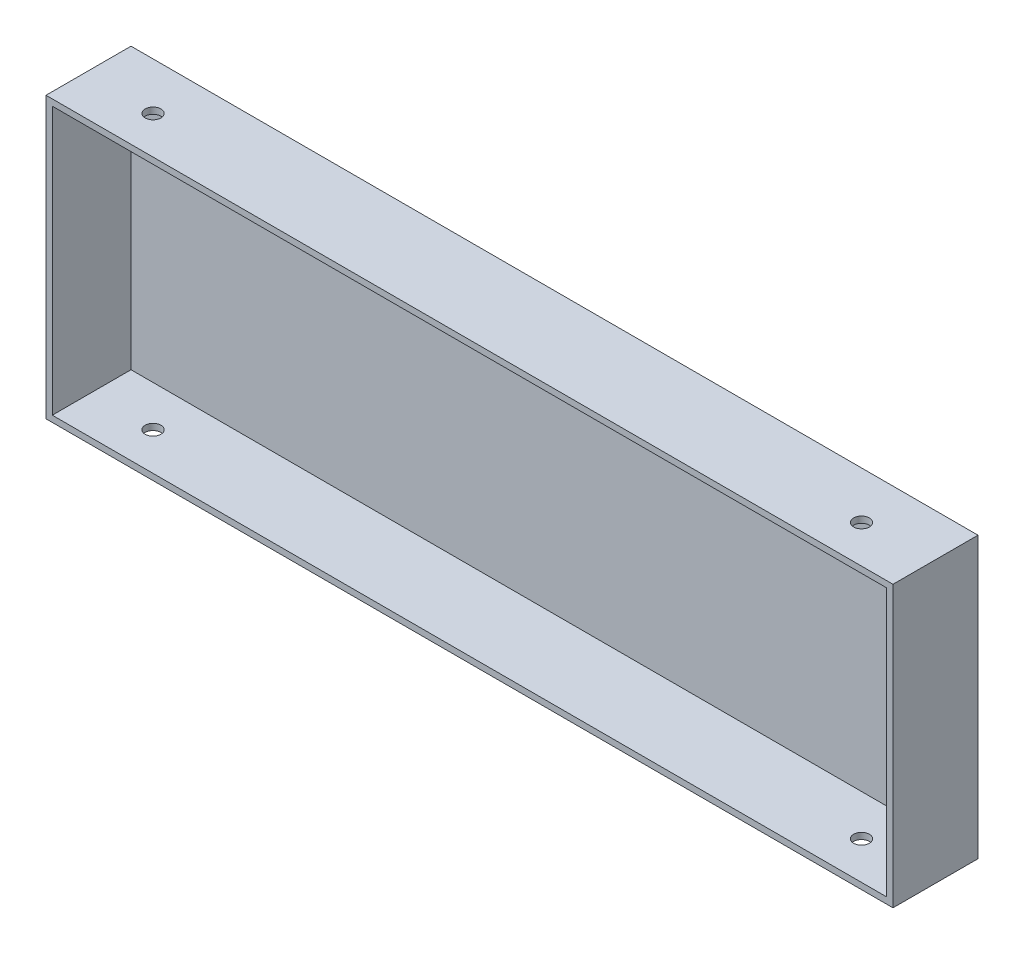
ISO-10303-21;
HEADER;
FILE_DESCRIPTION(('STEP AP214'),'2;1');
FILE_NAME('part.step','',(''),(''),'','','');
FILE_SCHEMA(('AUTOMOTIVE_DESIGN { 1 0 10303 214 1 1 1 1 }'));
ENDSEC;
DATA;
#1=APPLICATION_CONTEXT('core data for automotive mechanical design processes');
#2=APPLICATION_PROTOCOL_DEFINITION('international standard','automotive_design',2000,#1);
#3=PRODUCT_CONTEXT('',#1,'mechanical');
#4=PRODUCT('Part','Part','',(#3));
#5=PRODUCT_RELATED_PRODUCT_CATEGORY('part','',(#4));
#6=PRODUCT_DEFINITION_FORMATION('','',#4);
#7=PRODUCT_DEFINITION_CONTEXT('part definition',#1,'design');
#8=PRODUCT_DEFINITION('design','',#6,#7);
#9=PRODUCT_DEFINITION_SHAPE('','',#8);
#10=(LENGTH_UNIT() NAMED_UNIT(*) SI_UNIT(.MILLI.,.METRE.));
#11=(NAMED_UNIT(*) PLANE_ANGLE_UNIT() SI_UNIT($,.RADIAN.));
#12=(NAMED_UNIT(*) SI_UNIT($,.STERADIAN.) SOLID_ANGLE_UNIT());
#13=UNCERTAINTY_MEASURE_WITH_UNIT(LENGTH_MEASURE(1.E-05),#10,'distance_accuracy_value','');
#14=(GEOMETRIC_REPRESENTATION_CONTEXT(3) GLOBAL_UNCERTAINTY_ASSIGNED_CONTEXT((#13)) GLOBAL_UNIT_ASSIGNED_CONTEXT((#10,
#11,#12)) REPRESENTATION_CONTEXT('',''));
#15=CARTESIAN_POINT('',(0.,0.,0.));
#16=DIRECTION('',(0.,0.,1.));
#17=DIRECTION('',(1.,0.,0.));
#18=AXIS2_PLACEMENT_3D('',#15,#16,#17);
#19=CARTESIAN_POINT('',(0.,0.,-2.));
#20=DIRECTION('',(0.,0.,-1.));
#21=DIRECTION('',(-1.,0.,0.));
#22=AXIS2_PLACEMENT_3D('',#19,#20,#21);
#23=PLANE('',#22);
#24=DIRECTION('',(0.,1.,0.));
#25=VECTOR('',#24,1.);
#26=CARTESIAN_POINT('',(-2.,0.,-2.));
#27=LINE('',#26,#25);
#28=CARTESIAN_POINT('',(-2.,-2.,-2.));
#29=VERTEX_POINT('',#28);
#30=CARTESIAN_POINT('',(-2.,87.,-2.));
#31=VERTEX_POINT('',#30);
#32=EDGE_CURVE('E184',#29,#31,#27,.T.);
#33=ORIENTED_EDGE('',*,*,#32,.T.);
#34=DIRECTION('',(1.,0.,0.));
#35=VECTOR('',#34,1.);
#36=CARTESIAN_POINT('',(0.,87.,-2.));
#37=LINE('',#36,#35);
#38=CARTESIAN_POINT('',(267.,87.,-2.));
#39=VERTEX_POINT('',#38);
#40=EDGE_CURVE('E192',#31,#39,#37,.T.);
#41=ORIENTED_EDGE('',*,*,#40,.T.);
#42=DIRECTION('',(0.,1.,0.));
#43=VECTOR('',#42,1.);
#44=CARTESIAN_POINT('',(267.,0.,-2.));
#45=LINE('',#44,#43);
#46=CARTESIAN_POINT('',(267.,-2.,-2.));
#47=VERTEX_POINT('',#46);
#48=EDGE_CURVE('E201',#47,#39,#45,.T.);
#49=ORIENTED_EDGE('',*,*,#48,.F.);
#50=DIRECTION('',(1.,0.,0.));
#51=VECTOR('',#50,1.);
#52=CARTESIAN_POINT('',(0.,-2.,-2.));
#53=LINE('',#52,#51);
#54=EDGE_CURVE('E198',#29,#47,#53,.T.);
#55=ORIENTED_EDGE('',*,*,#54,.F.);
#56=EDGE_LOOP('',(#33,#41,#49,#55));
#57=FACE_BOUND('',#56,.T.);
#58=DIRECTION('',(0.,-1.,0.));
#59=VECTOR('',#58,1.);
#60=CARTESIAN_POINT('',(157.5,43.5,-2.));
#61=LINE('',#60,#59);
#62=CARTESIAN_POINT('',(157.5,43.5,-2.));
#63=VERTEX_POINT('',#62);
#64=CARTESIAN_POINT('',(157.5,41.5,-2.));
#65=VERTEX_POINT('',#64);
#66=EDGE_CURVE('E57',#63,#65,#61,.T.);
#67=ORIENTED_EDGE('',*,*,#66,.F.);
#68=DIRECTION('',(1.,0.,0.));
#69=VECTOR('',#68,1.);
#70=CARTESIAN_POINT('',(107.5,43.5,-2.));
#71=LINE('',#70,#69);
#72=CARTESIAN_POINT('',(107.5,43.5,-2.));
#73=VERTEX_POINT('',#72);
#74=EDGE_CURVE('E52',#73,#63,#71,.T.);
#75=ORIENTED_EDGE('',*,*,#74,.F.);
#76=DIRECTION('',(0.,-1.,0.));
#77=VECTOR('',#76,1.);
#78=CARTESIAN_POINT('',(107.5,43.5,-2.));
#79=LINE('',#78,#77);
#80=CARTESIAN_POINT('',(107.5,41.5,-2.));
#81=VERTEX_POINT('',#80);
#82=EDGE_CURVE('E157',#73,#81,#79,.T.);
#83=ORIENTED_EDGE('',*,*,#82,.T.);
#84=DIRECTION('',(1.,0.,0.));
#85=VECTOR('',#84,1.);
#86=CARTESIAN_POINT('',(107.5,41.5,-2.));
#87=LINE('',#86,#85);
#88=EDGE_CURVE('E149',#81,#65,#87,.T.);
#89=ORIENTED_EDGE('',*,*,#88,.T.);
#90=EDGE_LOOP('',(#67,#75,#83,#89));
#91=FACE_BOUND('',#90,.T.);
#92=ADVANCED_FACE('F36',(#57,#91),#23,.T.);
#93=CARTESIAN_POINT('',(-2.,0.,25.));
#94=DIRECTION('',(-1.,0.,0.));
#95=DIRECTION('',(0.,0.,1.));
#96=AXIS2_PLACEMENT_3D('',#93,#94,#95);
#97=PLANE('',#96);
#98=ORIENTED_EDGE('',*,*,#32,.F.);
#99=DIRECTION('',(0.,0.,-1.));
#100=VECTOR('',#99,1.);
#101=CARTESIAN_POINT('',(-2.,-2.,25.));
#102=LINE('',#101,#100);
#103=CARTESIAN_POINT('',(-2.,-2.,25.));
#104=VERTEX_POINT('',#103);
#105=EDGE_CURVE('E11',#104,#29,#102,.T.);
#106=ORIENTED_EDGE('',*,*,#105,.F.);
#107=DIRECTION('',(0.,1.,0.));
#108=VECTOR('',#107,1.);
#109=CARTESIAN_POINT('',(-2.,0.,25.));
#110=LINE('',#109,#108);
#111=CARTESIAN_POINT('',(-2.,87.,25.));
#112=VERTEX_POINT('',#111);
#113=EDGE_CURVE('E200',#104,#112,#110,.T.);
#114=ORIENTED_EDGE('',*,*,#113,.T.);
#115=DIRECTION('',(0.,0.,-1.));
#116=VECTOR('',#115,1.);
#117=CARTESIAN_POINT('',(-2.,87.,25.));
#118=LINE('',#117,#116);
#119=EDGE_CURVE('E194',#112,#31,#118,.T.);
#120=ORIENTED_EDGE('',*,*,#119,.T.);
#121=EDGE_LOOP('',(#98,#106,#114,#120));
#122=FACE_BOUND('',#121,.T.);
#123=ADVANCED_FACE('F224',(#122),#97,.T.);
#124=CARTESIAN_POINT('',(0.,-2.,25.));
#125=DIRECTION('',(0.,1.,0.));
#126=DIRECTION('',(0.,0.,1.));
#127=AXIS2_PLACEMENT_3D('',#124,#125,#126);
#128=PLANE('',#127);
#129=CARTESIAN_POINT('',(245.,-2.,13.));
#130=DIRECTION('',(0.,1.,0.));
#131=DIRECTION('',(0.,0.,1.));
#132=AXIS2_PLACEMENT_3D('',#129,#130,#131);
#133=CIRCLE('',#132,2.5);
#134=CARTESIAN_POINT('',(245.,-2.,10.5));
#135=VERTEX_POINT('',#134);
#136=EDGE_CURVE('E453',#135,#135,#133,.T.);
#137=ORIENTED_EDGE('',*,*,#136,.T.);
#138=EDGE_LOOP('',(#137));
#139=FACE_BOUND('',#138,.T.);
#140=CARTESIAN_POINT('',(20.,-2.,13.));
#141=DIRECTION('',(0.,1.,0.));
#142=DIRECTION('',(0.,0.,1.));
#143=AXIS2_PLACEMENT_3D('',#140,#141,#142);
#144=CIRCLE('',#143,2.5);
#145=CARTESIAN_POINT('',(20.,-2.,10.5));
#146=VERTEX_POINT('',#145);
#147=EDGE_CURVE('E454',#146,#146,#144,.T.);
#148=ORIENTED_EDGE('',*,*,#147,.T.);
#149=EDGE_LOOP('',(#148));
#150=FACE_BOUND('',#149,.T.);
#151=ORIENTED_EDGE('',*,*,#54,.T.);
#152=DIRECTION('',(0.,0.,-1.));
#153=VECTOR('',#152,1.);
#154=CARTESIAN_POINT('',(267.,-2.,25.));
#155=LINE('',#154,#153);
#156=CARTESIAN_POINT('',(267.,-2.,25.));
#157=VERTEX_POINT('',#156);
#158=EDGE_CURVE('E44',#157,#47,#155,.T.);
#159=ORIENTED_EDGE('',*,*,#158,.F.);
#160=DIRECTION('',(1.,0.,0.));
#161=VECTOR('',#160,1.);
#162=CARTESIAN_POINT('',(0.,-2.,25.));
#163=LINE('',#162,#161);
#164=EDGE_CURVE('E197',#104,#157,#163,.T.);
#165=ORIENTED_EDGE('',*,*,#164,.F.);
#166=ORIENTED_EDGE('',*,*,#105,.T.);
#167=EDGE_LOOP('',(#151,#159,#165,#166));
#168=FACE_BOUND('',#167,.T.);
#169=ADVANCED_FACE('F229',(#139,#150,#168),#128,.F.);
#170=CARTESIAN_POINT('',(267.,0.,25.));
#171=DIRECTION('',(-1.,0.,0.));
#172=DIRECTION('',(0.,0.,1.));
#173=AXIS2_PLACEMENT_3D('',#170,#171,#172);
#174=PLANE('',#173);
#175=ORIENTED_EDGE('',*,*,#48,.T.);
#176=DIRECTION('',(0.,0.,-1.));
#177=VECTOR('',#176,1.);
#178=CARTESIAN_POINT('',(267.,87.,25.));
#179=LINE('',#178,#177);
#180=CARTESIAN_POINT('',(267.,87.,25.));
#181=VERTEX_POINT('',#180);
#182=EDGE_CURVE('E196',#181,#39,#179,.T.);
#183=ORIENTED_EDGE('',*,*,#182,.F.);
#184=DIRECTION('',(0.,1.,0.));
#185=VECTOR('',#184,1.);
#186=CARTESIAN_POINT('',(267.,0.,25.));
#187=LINE('',#186,#185);
#188=EDGE_CURVE('E211',#157,#181,#187,.T.);
#189=ORIENTED_EDGE('',*,*,#188,.F.);
#190=ORIENTED_EDGE('',*,*,#158,.T.);
#191=EDGE_LOOP('',(#175,#183,#189,#190));
#192=FACE_BOUND('',#191,.T.);
#193=ADVANCED_FACE('F232',(#192),#174,.F.);
#194=CARTESIAN_POINT('',(0.,87.,25.));
#195=DIRECTION('',(0.,1.,0.));
#196=DIRECTION('',(0.,0.,1.));
#197=AXIS2_PLACEMENT_3D('',#194,#195,#196);
#198=PLANE('',#197);
#199=CARTESIAN_POINT('',(245.,87.,13.));
#200=DIRECTION('',(0.,1.,0.));
#201=DIRECTION('',(0.,0.,1.));
#202=AXIS2_PLACEMENT_3D('',#199,#200,#201);
#203=CIRCLE('',#202,2.5);
#204=CARTESIAN_POINT('',(245.,87.,15.5));
#205=VERTEX_POINT('',#204);
#206=EDGE_CURVE('E258',#205,#205,#203,.T.);
#207=ORIENTED_EDGE('',*,*,#206,.F.);
#208=EDGE_LOOP('',(#207));
#209=FACE_BOUND('',#208,.T.);
#210=CARTESIAN_POINT('',(20.,87.,13.));
#211=DIRECTION('',(0.,1.,0.));
#212=DIRECTION('',(0.,0.,1.));
#213=AXIS2_PLACEMENT_3D('',#210,#211,#212);
#214=CIRCLE('',#213,2.5);
#215=CARTESIAN_POINT('',(20.,87.,15.5));
#216=VERTEX_POINT('',#215);
#217=EDGE_CURVE('E261',#216,#216,#214,.T.);
#218=ORIENTED_EDGE('',*,*,#217,.F.);
#219=EDGE_LOOP('',(#218));
#220=FACE_BOUND('',#219,.T.);
#221=ORIENTED_EDGE('',*,*,#40,.F.);
#222=ORIENTED_EDGE('',*,*,#119,.F.);
#223=DIRECTION('',(1.,0.,0.));
#224=VECTOR('',#223,1.);
#225=CARTESIAN_POINT('',(0.,87.,25.));
#226=LINE('',#225,#224);
#227=EDGE_CURVE('E39',#112,#181,#226,.T.);
#228=ORIENTED_EDGE('',*,*,#227,.T.);
#229=ORIENTED_EDGE('',*,*,#182,.T.);
#230=EDGE_LOOP('',(#221,#222,#228,#229));
#231=FACE_BOUND('',#230,.T.);
#232=ADVANCED_FACE('F219',(#209,#220,#231),#198,.T.);
#233=CARTESIAN_POINT('',(0.,0.,25.));
#234=DIRECTION('',(0.,0.,-1.));
#235=DIRECTION('',(-1.,0.,0.));
#236=AXIS2_PLACEMENT_3D('',#233,#234,#235);
#237=PLANE('',#236);
#238=DIRECTION('',(1.,0.,0.));
#239=VECTOR('',#238,1.);
#240=CARTESIAN_POINT('',(0.,0.,25.));
#241=LINE('',#240,#239);
#242=CARTESIAN_POINT('',(0.,0.,25.));
#243=VERTEX_POINT('',#242);
#244=CARTESIAN_POINT('',(265.,0.,25.));
#245=VERTEX_POINT('',#244);
#246=EDGE_CURVE('E170',#243,#245,#241,.T.);
#247=ORIENTED_EDGE('',*,*,#246,.F.);
#248=DIRECTION('',(0.,1.,0.));
#249=VECTOR('',#248,1.);
#250=CARTESIAN_POINT('',(0.,0.,25.));
#251=LINE('',#250,#249);
#252=CARTESIAN_POINT('',(0.,85.,25.));
#253=VERTEX_POINT('',#252);
#254=EDGE_CURVE('E160',#243,#253,#251,.T.);
#255=ORIENTED_EDGE('',*,*,#254,.T.);
#256=DIRECTION('',(1.,0.,0.));
#257=VECTOR('',#256,1.);
#258=CARTESIAN_POINT('',(0.,85.,25.));
#259=LINE('',#258,#257);
#260=CARTESIAN_POINT('',(265.,85.,25.));
#261=VERTEX_POINT('',#260);
#262=EDGE_CURVE('E163',#253,#261,#259,.T.);
#263=ORIENTED_EDGE('',*,*,#262,.T.);
#264=DIRECTION('',(0.,1.,0.));
#265=VECTOR('',#264,1.);
#266=CARTESIAN_POINT('',(265.,0.,25.));
#267=LINE('',#266,#265);
#268=EDGE_CURVE('E167',#245,#261,#267,.T.);
#269=ORIENTED_EDGE('',*,*,#268,.F.);
#270=EDGE_LOOP('',(#247,#255,#263,#269));
#271=FACE_BOUND('',#270,.T.);
#272=ORIENTED_EDGE('',*,*,#113,.F.);
#273=ORIENTED_EDGE('',*,*,#164,.T.);
#274=ORIENTED_EDGE('',*,*,#188,.T.);
#275=ORIENTED_EDGE('',*,*,#227,.F.);
#276=EDGE_LOOP('',(#272,#273,#274,#275));
#277=FACE_BOUND('',#276,.T.);
#278=ADVANCED_FACE('F221',(#271,#277),#237,.F.);
#279=CARTESIAN_POINT('',(0.,0.,25.));
#280=DIRECTION('',(-1.,0.,0.));
#281=DIRECTION('',(0.,0.,1.));
#282=AXIS2_PLACEMENT_3D('',#279,#280,#281);
#283=PLANE('',#282);
#284=DIRECTION('',(0.,1.,0.));
#285=VECTOR('',#284,1.);
#286=CARTESIAN_POINT('',(0.,0.,0.));
#287=LINE('',#286,#285);
#288=CARTESIAN_POINT('',(0.,0.,0.));
#289=VERTEX_POINT('',#288);
#290=CARTESIAN_POINT('',(0.,85.,0.));
#291=VERTEX_POINT('',#290);
#292=EDGE_CURVE('E159',#289,#291,#287,.T.);
#293=ORIENTED_EDGE('',*,*,#292,.T.);
#294=DIRECTION('',(0.,0.,-1.));
#295=VECTOR('',#294,1.);
#296=CARTESIAN_POINT('',(0.,85.,25.));
#297=LINE('',#296,#295);
#298=EDGE_CURVE('E172',#253,#291,#297,.T.);
#299=ORIENTED_EDGE('',*,*,#298,.F.);
#300=ORIENTED_EDGE('',*,*,#254,.F.);
#301=DIRECTION('',(0.,0.,-1.));
#302=VECTOR('',#301,1.);
#303=CARTESIAN_POINT('',(0.,0.,25.));
#304=LINE('',#303,#302);
#305=EDGE_CURVE('E182',#243,#289,#304,.T.);
#306=ORIENTED_EDGE('',*,*,#305,.T.);
#307=EDGE_LOOP('',(#293,#299,#300,#306));
#308=FACE_BOUND('',#307,.T.);
#309=ADVANCED_FACE('F253',(#308),#283,.F.);
#310=CARTESIAN_POINT('',(0.,0.,25.));
#311=DIRECTION('',(0.,1.,0.));
#312=DIRECTION('',(0.,0.,1.));
#313=AXIS2_PLACEMENT_3D('',#310,#311,#312);
#314=PLANE('',#313);
#315=CARTESIAN_POINT('',(245.,0.,13.));
#316=DIRECTION('',(0.,1.,0.));
#317=DIRECTION('',(0.,0.,1.));
#318=AXIS2_PLACEMENT_3D('',#315,#316,#317);
#319=CIRCLE('',#318,2.5);
#320=CARTESIAN_POINT('',(245.,0.,10.5));
#321=VERTEX_POINT('',#320);
#322=EDGE_CURVE('E264',#321,#321,#319,.F.);
#323=ORIENTED_EDGE('',*,*,#322,.T.);
#324=EDGE_LOOP('',(#323));
#325=FACE_BOUND('',#324,.T.);
#326=CARTESIAN_POINT('',(20.,0.,13.));
#327=DIRECTION('',(0.,1.,0.));
#328=DIRECTION('',(0.,0.,1.));
#329=AXIS2_PLACEMENT_3D('',#326,#327,#328);
#330=CIRCLE('',#329,2.5);
#331=CARTESIAN_POINT('',(20.,0.,10.5));
#332=VERTEX_POINT('',#331);
#333=EDGE_CURVE('E269',#332,#332,#330,.F.);
#334=ORIENTED_EDGE('',*,*,#333,.T.);
#335=EDGE_LOOP('',(#334));
#336=FACE_BOUND('',#335,.T.);
#337=DIRECTION('',(1.,0.,0.));
#338=VECTOR('',#337,1.);
#339=CARTESIAN_POINT('',(0.,0.,0.));
#340=LINE('',#339,#338);
#341=CARTESIAN_POINT('',(265.,0.,0.));
#342=VERTEX_POINT('',#341);
#343=EDGE_CURVE('E164',#289,#342,#340,.T.);
#344=ORIENTED_EDGE('',*,*,#343,.F.);
#345=ORIENTED_EDGE('',*,*,#305,.F.);
#346=ORIENTED_EDGE('',*,*,#246,.T.);
#347=DIRECTION('',(0.,0.,-1.));
#348=VECTOR('',#347,1.);
#349=CARTESIAN_POINT('',(265.,0.,25.));
#350=LINE('',#349,#348);
#351=EDGE_CURVE('E185',#245,#342,#350,.T.);
#352=ORIENTED_EDGE('',*,*,#351,.T.);
#353=EDGE_LOOP('',(#344,#345,#346,#352));
#354=FACE_BOUND('',#353,.T.);
#355=ADVANCED_FACE('F304',(#325,#336,#354),#314,.T.);
#356=CARTESIAN_POINT('',(265.,0.,25.));
#357=DIRECTION('',(-1.,0.,0.));
#358=DIRECTION('',(0.,0.,1.));
#359=AXIS2_PLACEMENT_3D('',#356,#357,#358);
#360=PLANE('',#359);
#361=DIRECTION('',(0.,1.,0.));
#362=VECTOR('',#361,1.);
#363=CARTESIAN_POINT('',(265.,0.,0.));
#364=LINE('',#363,#362);
#365=CARTESIAN_POINT('',(265.,85.,0.));
#366=VERTEX_POINT('',#365);
#367=EDGE_CURVE('E178',#342,#366,#364,.T.);
#368=ORIENTED_EDGE('',*,*,#367,.F.);
#369=ORIENTED_EDGE('',*,*,#351,.F.);
#370=ORIENTED_EDGE('',*,*,#268,.T.);
#371=DIRECTION('',(0.,0.,-1.));
#372=VECTOR('',#371,1.);
#373=CARTESIAN_POINT('',(265.,85.,25.));
#374=LINE('',#373,#372);
#375=EDGE_CURVE('E188',#261,#366,#374,.T.);
#376=ORIENTED_EDGE('',*,*,#375,.T.);
#377=EDGE_LOOP('',(#368,#369,#370,#376));
#378=FACE_BOUND('',#377,.T.);
#379=ADVANCED_FACE('F307',(#378),#360,.T.);
#380=CARTESIAN_POINT('',(0.,85.,25.));
#381=DIRECTION('',(0.,1.,0.));
#382=DIRECTION('',(0.,0.,1.));
#383=AXIS2_PLACEMENT_3D('',#380,#381,#382);
#384=PLANE('',#383);
#385=CARTESIAN_POINT('',(245.,85.,13.));
#386=DIRECTION('',(0.,1.,0.));
#387=DIRECTION('',(0.,0.,1.));
#388=AXIS2_PLACEMENT_3D('',#385,#386,#387);
#389=CIRCLE('',#388,2.5);
#390=CARTESIAN_POINT('',(245.,85.,15.5));
#391=VERTEX_POINT('',#390);
#392=EDGE_CURVE('E150',#391,#391,#389,.F.);
#393=ORIENTED_EDGE('',*,*,#392,.F.);
#394=EDGE_LOOP('',(#393));
#395=FACE_BOUND('',#394,.T.);
#396=CARTESIAN_POINT('',(20.,85.,13.));
#397=DIRECTION('',(0.,1.,0.));
#398=DIRECTION('',(0.,0.,1.));
#399=AXIS2_PLACEMENT_3D('',#396,#397,#398);
#400=CIRCLE('',#399,2.5);
#401=CARTESIAN_POINT('',(20.,85.,15.5));
#402=VERTEX_POINT('',#401);
#403=EDGE_CURVE('E263',#402,#402,#400,.F.);
#404=ORIENTED_EDGE('',*,*,#403,.F.);
#405=EDGE_LOOP('',(#404));
#406=FACE_BOUND('',#405,.T.);
#407=DIRECTION('',(1.,0.,0.));
#408=VECTOR('',#407,1.);
#409=CARTESIAN_POINT('',(0.,85.,0.));
#410=LINE('',#409,#408);
#411=EDGE_CURVE('E175',#291,#366,#410,.T.);
#412=ORIENTED_EDGE('',*,*,#411,.T.);
#413=ORIENTED_EDGE('',*,*,#375,.F.);
#414=ORIENTED_EDGE('',*,*,#262,.F.);
#415=ORIENTED_EDGE('',*,*,#298,.T.);
#416=EDGE_LOOP('',(#412,#413,#414,#415));
#417=FACE_BOUND('',#416,.T.);
#418=ADVANCED_FACE('F302',(#395,#406,#417),#384,.F.);
#419=CARTESIAN_POINT('',(0.,0.,0.));
#420=DIRECTION('',(0.,0.,-1.));
#421=DIRECTION('',(-1.,0.,0.));
#422=AXIS2_PLACEMENT_3D('',#419,#420,#421);
#423=PLANE('',#422);
#424=ORIENTED_EDGE('',*,*,#292,.F.);
#425=ORIENTED_EDGE('',*,*,#343,.T.);
#426=ORIENTED_EDGE('',*,*,#367,.T.);
#427=ORIENTED_EDGE('',*,*,#411,.F.);
#428=EDGE_LOOP('',(#424,#425,#426,#427));
#429=FACE_BOUND('',#428,.T.);
#430=ADVANCED_FACE('F299',(#429),#423,.F.);
#431=CARTESIAN_POINT('',(107.5,43.5,-2.));
#432=DIRECTION('',(1.,0.,0.));
#433=DIRECTION('',(0.,0.,-1.));
#434=AXIS2_PLACEMENT_3D('',#431,#432,#433);
#435=PLANE('',#434);
#436=DIRECTION('',(0.,0.,1.));
#437=VECTOR('',#436,1.);
#438=CARTESIAN_POINT('',(107.5,41.5,-2.));
#439=LINE('',#438,#437);
#440=CARTESIAN_POINT('',(107.5,41.5,-22.));
#441=VERTEX_POINT('',#440);
#442=EDGE_CURVE('E146',#441,#81,#439,.T.);
#443=ORIENTED_EDGE('',*,*,#442,.T.);
#444=ORIENTED_EDGE('',*,*,#82,.F.);
#445=DIRECTION('',(0.,0.,1.));
#446=VECTOR('',#445,1.);
#447=CARTESIAN_POINT('',(107.5,43.5,-2.));
#448=LINE('',#447,#446);
#449=CARTESIAN_POINT('',(107.5,43.5,-22.));
#450=VERTEX_POINT('',#449);
#451=EDGE_CURVE('E154',#450,#73,#448,.T.);
#452=ORIENTED_EDGE('',*,*,#451,.F.);
#453=DIRECTION('',(0.,-1.,0.));
#454=VECTOR('',#453,1.);
#455=CARTESIAN_POINT('',(107.5,43.5,-22.));
#456=LINE('',#455,#454);
#457=EDGE_CURVE('E137',#450,#441,#456,.T.);
#458=ORIENTED_EDGE('',*,*,#457,.T.);
#459=EDGE_LOOP('',(#443,#444,#452,#458));
#460=FACE_BOUND('',#459,.T.);
#461=ADVANCED_FACE('F276',(#460),#435,.F.);
#462=CARTESIAN_POINT('',(157.5,43.5,-2.));
#463=DIRECTION('',(-1.,0.,0.));
#464=DIRECTION('',(0.,0.,1.));
#465=AXIS2_PLACEMENT_3D('',#462,#463,#464);
#466=PLANE('',#465);
#467=DIRECTION('',(0.,0.,-1.));
#468=VECTOR('',#467,1.);
#469=CARTESIAN_POINT('',(157.5,41.5,-2.));
#470=LINE('',#469,#468);
#471=CARTESIAN_POINT('',(157.5,41.5,-22.));
#472=VERTEX_POINT('',#471);
#473=EDGE_CURVE('E134',#65,#472,#470,.T.);
#474=ORIENTED_EDGE('',*,*,#473,.T.);
#475=DIRECTION('',(0.,-1.,0.));
#476=VECTOR('',#475,1.);
#477=CARTESIAN_POINT('',(157.5,43.5,-22.));
#478=LINE('',#477,#476);
#479=CARTESIAN_POINT('',(157.5,43.5,-22.));
#480=VERTEX_POINT('',#479);
#481=EDGE_CURVE('E131',#480,#472,#478,.T.);
#482=ORIENTED_EDGE('',*,*,#481,.F.);
#483=DIRECTION('',(0.,0.,-1.));
#484=VECTOR('',#483,1.);
#485=CARTESIAN_POINT('',(157.5,43.5,-2.));
#486=LINE('',#485,#484);
#487=EDGE_CURVE('E122',#63,#480,#486,.T.);
#488=ORIENTED_EDGE('',*,*,#487,.F.);
#489=ORIENTED_EDGE('',*,*,#66,.T.);
#490=EDGE_LOOP('',(#474,#482,#488,#489));
#491=FACE_BOUND('',#490,.T.);
#492=ADVANCED_FACE('F132',(#491),#466,.F.);
#493=CARTESIAN_POINT('',(107.5,43.5,-22.));
#494=DIRECTION('',(0.,0.,1.));
#495=DIRECTION('',(1.,0.,0.));
#496=AXIS2_PLACEMENT_3D('',#493,#494,#495);
#497=PLANE('',#496);
#498=DIRECTION('',(-1.,0.,0.));
#499=VECTOR('',#498,1.);
#500=CARTESIAN_POINT('',(107.5,41.5,-22.));
#501=LINE('',#500,#499);
#502=EDGE_CURVE('E153',#472,#441,#501,.T.);
#503=ORIENTED_EDGE('',*,*,#502,.T.);
#504=ORIENTED_EDGE('',*,*,#457,.F.);
#505=DIRECTION('',(-1.,0.,0.));
#506=VECTOR('',#505,1.);
#507=CARTESIAN_POINT('',(107.5,43.5,-22.));
#508=LINE('',#507,#506);
#509=EDGE_CURVE('E126',#480,#450,#508,.T.);
#510=ORIENTED_EDGE('',*,*,#509,.F.);
#511=ORIENTED_EDGE('',*,*,#481,.T.);
#512=EDGE_LOOP('',(#503,#504,#510,#511));
#513=FACE_BOUND('',#512,.T.);
#514=ADVANCED_FACE('F139',(#513),#497,.F.);
#515=CARTESIAN_POINT('',(0.,43.5,0.));
#516=DIRECTION('',(0.,-1.,0.));
#517=DIRECTION('',(0.,0.,-1.));
#518=AXIS2_PLACEMENT_3D('',#515,#516,#517);
#519=PLANE('',#518);
#520=ORIENTED_EDGE('',*,*,#451,.T.);
#521=ORIENTED_EDGE('',*,*,#74,.T.);
#522=ORIENTED_EDGE('',*,*,#487,.T.);
#523=ORIENTED_EDGE('',*,*,#509,.T.);
#524=EDGE_LOOP('',(#520,#521,#522,#523));
#525=FACE_BOUND('',#524,.T.);
#526=ADVANCED_FACE('F124',(#525),#519,.F.);
#527=CARTESIAN_POINT('',(0.,41.5,0.));
#528=DIRECTION('',(0.,-1.,0.));
#529=DIRECTION('',(0.,0.,-1.));
#530=AXIS2_PLACEMENT_3D('',#527,#528,#529);
#531=PLANE('',#530);
#532=ORIENTED_EDGE('',*,*,#442,.F.);
#533=ORIENTED_EDGE('',*,*,#502,.F.);
#534=ORIENTED_EDGE('',*,*,#473,.F.);
#535=ORIENTED_EDGE('',*,*,#88,.F.);
#536=EDGE_LOOP('',(#532,#533,#534,#535));
#537=FACE_BOUND('',#536,.T.);
#538=ADVANCED_FACE('F280',(#537),#531,.T.);
#539=CARTESIAN_POINT('',(20.,77.9289321881345,13.));
#540=DIRECTION('',(0.,1.,0.));
#541=DIRECTION('',(0.,0.,1.));
#542=AXIS2_PLACEMENT_3D('',#539,#540,#541);
#543=CYLINDRICAL_SURFACE('',#542,2.5);
#544=CARTESIAN_POINT('',(20.,85.,15.5));
#545=CARTESIAN_POINT('',(20.,85.0208333333333,15.5));
#546=CARTESIAN_POINT('',(20.,85.0416666666667,15.5));
#547=CARTESIAN_POINT('',(20.,85.0833333333333,15.5));
#548=CARTESIAN_POINT('',(20.,85.1041666666667,15.5));
#549=CARTESIAN_POINT('',(20.,85.1458333333333,15.5));
#550=CARTESIAN_POINT('',(20.,85.1666666666667,15.5));
#551=CARTESIAN_POINT('',(20.,85.2083333333333,15.5));
#552=CARTESIAN_POINT('',(20.,85.2291666666667,15.5));
#553=CARTESIAN_POINT('',(20.,85.2708333333333,15.5));
#554=CARTESIAN_POINT('',(20.,85.2916666666667,15.5));
#555=CARTESIAN_POINT('',(20.,85.3333333333333,15.5));
#556=CARTESIAN_POINT('',(20.,85.3541666666667,15.5));
#557=CARTESIAN_POINT('',(20.,85.3958333333333,15.5));
#558=CARTESIAN_POINT('',(20.,85.4166666666667,15.5));
#559=CARTESIAN_POINT('',(20.,85.4583333333333,15.5));
#560=CARTESIAN_POINT('',(20.,85.4791666666667,15.5));
#561=CARTESIAN_POINT('',(20.,85.5208333333333,15.5));
#562=CARTESIAN_POINT('',(20.,85.5416666666667,15.5));
#563=CARTESIAN_POINT('',(20.,85.5833333333333,15.5));
#564=CARTESIAN_POINT('',(20.,85.6041666666667,15.5));
#565=CARTESIAN_POINT('',(20.,85.6458333333333,15.5));
#566=CARTESIAN_POINT('',(20.,85.6666666666667,15.5));
#567=CARTESIAN_POINT('',(20.,85.7083333333333,15.5));
#568=CARTESIAN_POINT('',(20.,85.7291666666667,15.5));
#569=CARTESIAN_POINT('',(20.,85.7708333333333,15.5));
#570=CARTESIAN_POINT('',(20.,85.7916666666667,15.5));
#571=CARTESIAN_POINT('',(20.,85.8333333333333,15.5));
#572=CARTESIAN_POINT('',(20.,85.8541666666667,15.5));
#573=CARTESIAN_POINT('',(20.,85.8958333333333,15.5));
#574=CARTESIAN_POINT('',(20.,85.9166666666667,15.5));
#575=CARTESIAN_POINT('',(20.,85.9583333333333,15.5));
#576=CARTESIAN_POINT('',(20.,85.9791666666667,15.5));
#577=CARTESIAN_POINT('',(20.,86.0208333333333,15.5));
#578=CARTESIAN_POINT('',(20.,86.0416666666667,15.5));
#579=CARTESIAN_POINT('',(20.,86.0833333333333,15.5));
#580=CARTESIAN_POINT('',(20.,86.1041666666667,15.5));
#581=CARTESIAN_POINT('',(20.,86.1458333333333,15.5));
#582=CARTESIAN_POINT('',(20.,86.1666666666667,15.5));
#583=CARTESIAN_POINT('',(20.,86.2083333333333,15.5));
#584=CARTESIAN_POINT('',(20.,86.2291666666667,15.5));
#585=CARTESIAN_POINT('',(20.,86.2708333333333,15.5));
#586=CARTESIAN_POINT('',(20.,86.2916666666667,15.5));
#587=CARTESIAN_POINT('',(20.,86.3333333333333,15.5));
#588=CARTESIAN_POINT('',(20.,86.3541666666667,15.5));
#589=CARTESIAN_POINT('',(20.,86.3958333333333,15.5));
#590=CARTESIAN_POINT('',(20.,86.4166666666667,15.5));
#591=CARTESIAN_POINT('',(20.,86.4583333333333,15.5));
#592=CARTESIAN_POINT('',(20.,86.4791666666667,15.5));
#593=CARTESIAN_POINT('',(20.,86.5208333333333,15.5));
#594=CARTESIAN_POINT('',(20.,86.5416666666667,15.5));
#595=CARTESIAN_POINT('',(20.,86.5833333333333,15.5));
#596=CARTESIAN_POINT('',(20.,86.6041666666667,15.5));
#597=CARTESIAN_POINT('',(20.,86.6458333333333,15.5));
#598=CARTESIAN_POINT('',(20.,86.6666666666667,15.5));
#599=CARTESIAN_POINT('',(20.,86.7083333333333,15.5));
#600=CARTESIAN_POINT('',(20.,86.7291666666667,15.5));
#601=CARTESIAN_POINT('',(20.,86.7708333333333,15.5));
#602=CARTESIAN_POINT('',(20.,86.7916666666667,15.5));
#603=CARTESIAN_POINT('',(20.,86.8333333333333,15.5));
#604=CARTESIAN_POINT('',(20.,86.8541666666667,15.5));
#605=CARTESIAN_POINT('',(20.,86.8958333333333,15.5));
#606=CARTESIAN_POINT('',(20.,86.9166666666667,15.5));
#607=CARTESIAN_POINT('',(20.,86.9583333333333,15.5));
#608=CARTESIAN_POINT('',(20.,86.9791666666667,15.5));
#609=CARTESIAN_POINT('',(20.,87.,15.5));
#610=B_SPLINE_CURVE_WITH_KNOTS('',3,(#544,#545,#546,#547,#548,#549,#550,#551,#552,#553,#554,
#555,#556,#557,#558,#559,#560,#561,#562,#563,#564,#565,#566,#567,#568,#569,#570,#571,#572,#573,
#574,#575,#576,#577,#578,#579,#580,#581,#582,#583,#584,#585,#586,#587,#588,#589,#590,#591,#592,
#593,#594,#595,#596,#597,#598,#599,#600,#601,#602,#603,#604,#605,#606,#607,#608,#609),
.UNSPECIFIED.,.F.,.F.,(4,2,2,2,2,2,2,2,2,2,2,2,2,2,2,2,2,2,2,2,2,2,2,2,2,2,2,2,2,2,2,2,4),(0.,
0.0624999999999931,0.125,0.187499999999993,0.25,0.312499999999993,0.375,0.437499999999993,0.5,
0.562499999999994,0.625000000000001,0.687499999999994,0.749999999999987,0.812499999999994,
0.875000000000001,0.937499999999994,1.,1.06249999999999,1.125,1.18749999999999,1.25,
1.31249999999999,1.375,1.43749999999999,1.5,1.56249999999999,1.625,1.68749999999999,1.75,
1.81249999999999,1.875,1.93749999999999,2.),.UNSPECIFIED.);
#611=EDGE_CURVE('BSEAM282',#402,#216,#610,.T.);
#612=ORIENTED_EDGE('',*,*,#403,.T.);
#613=ORIENTED_EDGE('',*,*,#217,.T.);
#614=ORIENTED_EDGE('',*,*,#611,.T.);
#615=ORIENTED_EDGE('',*,*,#611,.F.);
#616=EDGE_LOOP('',(#612,#614,#613,#615));
#617=FACE_BOUND('',#616,.T.);
#618=ADVANCED_FACE('F282',(#617),#543,.F.);
#619=CARTESIAN_POINT('',(245.,77.9289321881345,13.));
#620=DIRECTION('',(0.,1.,0.));
#621=DIRECTION('',(0.,0.,1.));
#622=AXIS2_PLACEMENT_3D('',#619,#620,#621);
#623=CYLINDRICAL_SURFACE('',#622,2.5);
#624=CARTESIAN_POINT('',(245.,85.,15.5));
#625=CARTESIAN_POINT('',(245.,85.0208333333333,15.5));
#626=CARTESIAN_POINT('',(245.,85.0416666666667,15.5));
#627=CARTESIAN_POINT('',(245.,85.0833333333333,15.5));
#628=CARTESIAN_POINT('',(245.,85.1041666666667,15.5));
#629=CARTESIAN_POINT('',(245.,85.1458333333333,15.5));
#630=CARTESIAN_POINT('',(245.,85.1666666666667,15.5));
#631=CARTESIAN_POINT('',(245.,85.2083333333333,15.5));
#632=CARTESIAN_POINT('',(245.,85.2291666666667,15.5));
#633=CARTESIAN_POINT('',(245.,85.2708333333333,15.5));
#634=CARTESIAN_POINT('',(245.,85.2916666666667,15.5));
#635=CARTESIAN_POINT('',(245.,85.3333333333333,15.5));
#636=CARTESIAN_POINT('',(245.,85.3541666666667,15.5));
#637=CARTESIAN_POINT('',(245.,85.3958333333333,15.5));
#638=CARTESIAN_POINT('',(245.,85.4166666666667,15.5));
#639=CARTESIAN_POINT('',(245.,85.4583333333333,15.5));
#640=CARTESIAN_POINT('',(245.,85.4791666666667,15.5));
#641=CARTESIAN_POINT('',(245.,85.5208333333333,15.5));
#642=CARTESIAN_POINT('',(245.,85.5416666666667,15.5));
#643=CARTESIAN_POINT('',(245.,85.5833333333333,15.5));
#644=CARTESIAN_POINT('',(245.,85.6041666666667,15.5));
#645=CARTESIAN_POINT('',(245.,85.6458333333333,15.5));
#646=CARTESIAN_POINT('',(245.,85.6666666666667,15.5));
#647=CARTESIAN_POINT('',(245.,85.7083333333333,15.5));
#648=CARTESIAN_POINT('',(245.,85.7291666666667,15.5));
#649=CARTESIAN_POINT('',(245.,85.7708333333333,15.5));
#650=CARTESIAN_POINT('',(245.,85.7916666666667,15.5));
#651=CARTESIAN_POINT('',(245.,85.8333333333333,15.5));
#652=CARTESIAN_POINT('',(245.,85.8541666666667,15.5));
#653=CARTESIAN_POINT('',(245.,85.8958333333333,15.5));
#654=CARTESIAN_POINT('',(245.,85.9166666666667,15.5));
#655=CARTESIAN_POINT('',(245.,85.9583333333333,15.5));
#656=CARTESIAN_POINT('',(245.,85.9791666666667,15.5));
#657=CARTESIAN_POINT('',(245.,86.0208333333333,15.5));
#658=CARTESIAN_POINT('',(245.,86.0416666666667,15.5));
#659=CARTESIAN_POINT('',(245.,86.0833333333333,15.5));
#660=CARTESIAN_POINT('',(245.,86.1041666666667,15.5));
#661=CARTESIAN_POINT('',(245.,86.1458333333333,15.5));
#662=CARTESIAN_POINT('',(245.,86.1666666666667,15.5));
#663=CARTESIAN_POINT('',(245.,86.2083333333333,15.5));
#664=CARTESIAN_POINT('',(245.,86.2291666666667,15.5));
#665=CARTESIAN_POINT('',(245.,86.2708333333333,15.5));
#666=CARTESIAN_POINT('',(245.,86.2916666666667,15.5));
#667=CARTESIAN_POINT('',(245.,86.3333333333333,15.5));
#668=CARTESIAN_POINT('',(245.,86.3541666666667,15.5));
#669=CARTESIAN_POINT('',(245.,86.3958333333333,15.5));
#670=CARTESIAN_POINT('',(245.,86.4166666666667,15.5));
#671=CARTESIAN_POINT('',(245.,86.4583333333333,15.5));
#672=CARTESIAN_POINT('',(245.,86.4791666666667,15.5));
#673=CARTESIAN_POINT('',(245.,86.5208333333333,15.5));
#674=CARTESIAN_POINT('',(245.,86.5416666666667,15.5));
#675=CARTESIAN_POINT('',(245.,86.5833333333333,15.5));
#676=CARTESIAN_POINT('',(245.,86.6041666666667,15.5));
#677=CARTESIAN_POINT('',(245.,86.6458333333333,15.5));
#678=CARTESIAN_POINT('',(245.,86.6666666666667,15.5));
#679=CARTESIAN_POINT('',(245.,86.7083333333333,15.5));
#680=CARTESIAN_POINT('',(245.,86.7291666666667,15.5));
#681=CARTESIAN_POINT('',(245.,86.7708333333333,15.5));
#682=CARTESIAN_POINT('',(245.,86.7916666666667,15.5));
#683=CARTESIAN_POINT('',(245.,86.8333333333333,15.5));
#684=CARTESIAN_POINT('',(245.,86.8541666666667,15.5));
#685=CARTESIAN_POINT('',(245.,86.8958333333333,15.5));
#686=CARTESIAN_POINT('',(245.,86.9166666666667,15.5));
#687=CARTESIAN_POINT('',(245.,86.9583333333333,15.5));
#688=CARTESIAN_POINT('',(245.,86.9791666666667,15.5));
#689=CARTESIAN_POINT('',(245.,87.,15.5));
#690=B_SPLINE_CURVE_WITH_KNOTS('',3,(#624,#625,#626,#627,#628,#629,#630,#631,#632,#633,#634,
#635,#636,#637,#638,#639,#640,#641,#642,#643,#644,#645,#646,#647,#648,#649,#650,#651,#652,#653,
#654,#655,#656,#657,#658,#659,#660,#661,#662,#663,#664,#665,#666,#667,#668,#669,#670,#671,#672,
#673,#674,#675,#676,#677,#678,#679,#680,#681,#682,#683,#684,#685,#686,#687,#688,#689),
.UNSPECIFIED.,.F.,.F.,(4,2,2,2,2,2,2,2,2,2,2,2,2,2,2,2,2,2,2,2,2,2,2,2,2,2,2,2,2,2,2,2,4),(0.,
0.0624999999999931,0.125,0.187499999999993,0.25,0.312499999999993,0.375,0.437499999999993,0.5,
0.562499999999994,0.625000000000001,0.687499999999994,0.749999999999987,0.812499999999994,
0.875000000000001,0.937499999999994,1.,1.06249999999999,1.125,1.18749999999999,1.25,
1.31249999999999,1.375,1.43749999999999,1.5,1.56249999999999,1.625,1.68749999999999,1.75,
1.81249999999999,1.875,1.93749999999999,2.),.UNSPECIFIED.);
#691=EDGE_CURVE('BSEAM288',#391,#205,#690,.T.);
#692=ORIENTED_EDGE('',*,*,#392,.T.);
#693=ORIENTED_EDGE('',*,*,#206,.T.);
#694=ORIENTED_EDGE('',*,*,#691,.T.);
#695=ORIENTED_EDGE('',*,*,#691,.F.);
#696=EDGE_LOOP('',(#692,#694,#693,#695));
#697=FACE_BOUND('',#696,.T.);
#698=ADVANCED_FACE('F288',(#697),#623,.F.);
#699=CARTESIAN_POINT('',(20.,92.0710678118655,13.));
#700=DIRECTION('',(0.,-1.,0.));
#701=DIRECTION('',(0.,0.,-1.));
#702=AXIS2_PLACEMENT_3D('',#699,#700,#701);
#703=CYLINDRICAL_SURFACE('',#702,2.5);
#704=CARTESIAN_POINT('',(20.,0.,10.5));
#705=CARTESIAN_POINT('',(20.,-0.020833333333331,10.5));
#706=CARTESIAN_POINT('',(20.,-0.0416666666666621,10.5));
#707=CARTESIAN_POINT('',(20.,-0.0833333333333288,10.5));
#708=CARTESIAN_POINT('',(20.,-0.104166666666664,10.5));
#709=CARTESIAN_POINT('',(20.,-0.145833333333336,10.5));
#710=CARTESIAN_POINT('',(20.,-0.166666666666671,10.5));
#711=CARTESIAN_POINT('',(20.,-0.208333333333338,10.5));
#712=CARTESIAN_POINT('',(20.,-0.229166666666669,10.5));
#713=CARTESIAN_POINT('',(20.,-0.270833333333331,10.5));
#714=CARTESIAN_POINT('',(20.,-0.291666666666662,10.5));
#715=CARTESIAN_POINT('',(20.,-0.333333333333329,10.5));
#716=CARTESIAN_POINT('',(20.,-0.354166666666665,10.5));
#717=CARTESIAN_POINT('',(20.,-0.395833333333336,10.5));
#718=CARTESIAN_POINT('',(20.,-0.416666666666672,10.5));
#719=CARTESIAN_POINT('',(20.,-0.458333333333338,10.5));
#720=CARTESIAN_POINT('',(20.,-0.479166666666669,10.5));
#721=CARTESIAN_POINT('',(20.,-0.520833333333331,10.5));
#722=CARTESIAN_POINT('',(20.,-0.541666666666663,10.5));
#723=CARTESIAN_POINT('',(20.,-0.583333333333329,10.5));
#724=CARTESIAN_POINT('',(20.,-0.604166666666665,10.5));
#725=CARTESIAN_POINT('',(20.,-0.645833333333336,10.5));
#726=CARTESIAN_POINT('',(20.,-0.666666666666672,10.5));
#727=CARTESIAN_POINT('',(20.,-0.708333333333339,10.5));
#728=CARTESIAN_POINT('',(20.,-0.72916666666667,10.5));
#729=CARTESIAN_POINT('',(20.,-0.770833333333332,10.5));
#730=CARTESIAN_POINT('',(20.,-0.791666666666663,10.5));
#731=CARTESIAN_POINT('',(20.,-0.833333333333329,10.5));
#732=CARTESIAN_POINT('',(20.,-0.854166666666665,10.5));
#733=CARTESIAN_POINT('',(20.,-0.895833333333336,10.5));
#734=CARTESIAN_POINT('',(20.,-0.916666666666672,10.5));
#735=CARTESIAN_POINT('',(20.,-0.958333333333339,10.5));
#736=CARTESIAN_POINT('',(20.,-0.97916666666667,10.5));
#737=CARTESIAN_POINT('',(20.,-1.02083333333333,10.5));
#738=CARTESIAN_POINT('',(20.,-1.04166666666666,10.5));
#739=CARTESIAN_POINT('',(20.,-1.08333333333333,10.5));
#740=CARTESIAN_POINT('',(20.,-1.10416666666667,10.5));
#741=CARTESIAN_POINT('',(20.,-1.14583333333334,10.5));
#742=CARTESIAN_POINT('',(20.,-1.16666666666667,10.5));
#743=CARTESIAN_POINT('',(20.,-1.20833333333334,10.5));
#744=CARTESIAN_POINT('',(20.,-1.22916666666667,10.5));
#745=CARTESIAN_POINT('',(20.,-1.27083333333333,10.5));
#746=CARTESIAN_POINT('',(20.,-1.29166666666666,10.5));
#747=CARTESIAN_POINT('',(20.,-1.33333333333333,10.5));
#748=CARTESIAN_POINT('',(20.,-1.35416666666667,10.5));
#749=CARTESIAN_POINT('',(20.,-1.39583333333334,10.5));
#750=CARTESIAN_POINT('',(20.,-1.41666666666667,10.5));
#751=CARTESIAN_POINT('',(20.,-1.45833333333334,10.5));
#752=CARTESIAN_POINT('',(20.,-1.47916666666667,10.5));
#753=CARTESIAN_POINT('',(20.,-1.52083333333333,10.5));
#754=CARTESIAN_POINT('',(20.,-1.54166666666666,10.5));
#755=CARTESIAN_POINT('',(20.,-1.58333333333333,10.5));
#756=CARTESIAN_POINT('',(20.,-1.60416666666667,10.5));
#757=CARTESIAN_POINT('',(20.,-1.64583333333334,10.5));
#758=CARTESIAN_POINT('',(20.,-1.66666666666667,10.5));
#759=CARTESIAN_POINT('',(20.,-1.70833333333334,10.5));
#760=CARTESIAN_POINT('',(20.,-1.72916666666667,10.5));
#761=CARTESIAN_POINT('',(20.,-1.77083333333333,10.5));
#762=CARTESIAN_POINT('',(20.,-1.79166666666666,10.5));
#763=CARTESIAN_POINT('',(20.,-1.83333333333333,10.5));
#764=CARTESIAN_POINT('',(20.,-1.85416666666667,10.5));
#765=CARTESIAN_POINT('',(20.,-1.89583333333334,10.5));
#766=CARTESIAN_POINT('',(20.,-1.91666666666667,10.5));
#767=CARTESIAN_POINT('',(20.,-1.95833333333334,10.5));
#768=CARTESIAN_POINT('',(20.,-1.97916666666667,10.5));
#769=CARTESIAN_POINT('',(20.,-2.,10.5));
#770=B_SPLINE_CURVE_WITH_KNOTS('',3,(#704,#705,#706,#707,#708,#709,#710,#711,#712,#713,#714,
#715,#716,#717,#718,#719,#720,#721,#722,#723,#724,#725,#726,#727,#728,#729,#730,#731,#732,#733,
#734,#735,#736,#737,#738,#739,#740,#741,#742,#743,#744,#745,#746,#747,#748,#749,#750,#751,#752,
#753,#754,#755,#756,#757,#758,#759,#760,#761,#762,#763,#764,#765,#766,#767,#768,#769),
.UNSPECIFIED.,.F.,.F.,(4,2,2,2,2,2,2,2,2,2,2,2,2,2,2,2,2,2,2,2,2,2,2,2,2,2,2,2,2,2,2,2,4),(0.,
0.0624999999999931,0.125,0.187500000000007,0.25,0.312499999999993,0.375,0.437500000000007,0.5,
0.562499999999994,0.625000000000001,0.687500000000008,0.750000000000001,0.812499999999994,
0.875000000000001,0.937500000000008,1.,1.06249999999999,1.125,1.18750000000001,1.25,
1.31249999999999,1.375,1.43750000000001,1.5,1.56249999999999,1.625,1.68750000000001,1.75,
1.81249999999999,1.875,1.93750000000001,2.),.UNSPECIFIED.);
#771=EDGE_CURVE('BSEAM421',#332,#146,#770,.T.);
#772=ORIENTED_EDGE('',*,*,#333,.F.);
#773=ORIENTED_EDGE('',*,*,#147,.F.);
#774=ORIENTED_EDGE('',*,*,#771,.T.);
#775=ORIENTED_EDGE('',*,*,#771,.F.);
#776=EDGE_LOOP('',(#772,#774,#773,#775));
#777=FACE_BOUND('',#776,.T.);
#778=ADVANCED_FACE('F421',(#777),#703,.F.);
#779=CARTESIAN_POINT('',(245.,92.0710678118655,13.));
#780=DIRECTION('',(0.,-1.,0.));
#781=DIRECTION('',(0.,0.,-1.));
#782=AXIS2_PLACEMENT_3D('',#779,#780,#781);
#783=CYLINDRICAL_SURFACE('',#782,2.5);
#784=CARTESIAN_POINT('',(245.,0.,10.5));
#785=CARTESIAN_POINT('',(245.,-0.020833333333331,10.5));
#786=CARTESIAN_POINT('',(245.,-0.0416666666666621,10.5));
#787=CARTESIAN_POINT('',(245.,-0.0833333333333288,10.5));
#788=CARTESIAN_POINT('',(245.,-0.104166666666664,10.5));
#789=CARTESIAN_POINT('',(245.,-0.145833333333336,10.5));
#790=CARTESIAN_POINT('',(245.,-0.166666666666671,10.5));
#791=CARTESIAN_POINT('',(245.,-0.208333333333338,10.5));
#792=CARTESIAN_POINT('',(245.,-0.229166666666669,10.5));
#793=CARTESIAN_POINT('',(245.,-0.270833333333331,10.5));
#794=CARTESIAN_POINT('',(245.,-0.291666666666662,10.5));
#795=CARTESIAN_POINT('',(245.,-0.333333333333329,10.5));
#796=CARTESIAN_POINT('',(245.,-0.354166666666665,10.5));
#797=CARTESIAN_POINT('',(245.,-0.395833333333336,10.5));
#798=CARTESIAN_POINT('',(245.,-0.416666666666672,10.5));
#799=CARTESIAN_POINT('',(245.,-0.458333333333338,10.5));
#800=CARTESIAN_POINT('',(245.,-0.479166666666669,10.5));
#801=CARTESIAN_POINT('',(245.,-0.520833333333331,10.5));
#802=CARTESIAN_POINT('',(245.,-0.541666666666663,10.5));
#803=CARTESIAN_POINT('',(245.,-0.583333333333329,10.5));
#804=CARTESIAN_POINT('',(245.,-0.604166666666665,10.5));
#805=CARTESIAN_POINT('',(245.,-0.645833333333336,10.5));
#806=CARTESIAN_POINT('',(245.,-0.666666666666672,10.5));
#807=CARTESIAN_POINT('',(245.,-0.708333333333339,10.5));
#808=CARTESIAN_POINT('',(245.,-0.72916666666667,10.5));
#809=CARTESIAN_POINT('',(245.,-0.770833333333332,10.5));
#810=CARTESIAN_POINT('',(245.,-0.791666666666663,10.5));
#811=CARTESIAN_POINT('',(245.,-0.833333333333329,10.5));
#812=CARTESIAN_POINT('',(245.,-0.854166666666665,10.5));
#813=CARTESIAN_POINT('',(245.,-0.895833333333336,10.5));
#814=CARTESIAN_POINT('',(245.,-0.916666666666672,10.5));
#815=CARTESIAN_POINT('',(245.,-0.958333333333339,10.5));
#816=CARTESIAN_POINT('',(245.,-0.97916666666667,10.5));
#817=CARTESIAN_POINT('',(245.,-1.02083333333333,10.5));
#818=CARTESIAN_POINT('',(245.,-1.04166666666666,10.5));
#819=CARTESIAN_POINT('',(245.,-1.08333333333333,10.5));
#820=CARTESIAN_POINT('',(245.,-1.10416666666667,10.5));
#821=CARTESIAN_POINT('',(245.,-1.14583333333334,10.5));
#822=CARTESIAN_POINT('',(245.,-1.16666666666667,10.5));
#823=CARTESIAN_POINT('',(245.,-1.20833333333334,10.5));
#824=CARTESIAN_POINT('',(245.,-1.22916666666667,10.5));
#825=CARTESIAN_POINT('',(245.,-1.27083333333333,10.5));
#826=CARTESIAN_POINT('',(245.,-1.29166666666666,10.5));
#827=CARTESIAN_POINT('',(245.,-1.33333333333333,10.5));
#828=CARTESIAN_POINT('',(245.,-1.35416666666667,10.5));
#829=CARTESIAN_POINT('',(245.,-1.39583333333334,10.5));
#830=CARTESIAN_POINT('',(245.,-1.41666666666667,10.5));
#831=CARTESIAN_POINT('',(245.,-1.45833333333334,10.5));
#832=CARTESIAN_POINT('',(245.,-1.47916666666667,10.5));
#833=CARTESIAN_POINT('',(245.,-1.52083333333333,10.5));
#834=CARTESIAN_POINT('',(245.,-1.54166666666666,10.5));
#835=CARTESIAN_POINT('',(245.,-1.58333333333333,10.5));
#836=CARTESIAN_POINT('',(245.,-1.60416666666667,10.5));
#837=CARTESIAN_POINT('',(245.,-1.64583333333334,10.5));
#838=CARTESIAN_POINT('',(245.,-1.66666666666667,10.5));
#839=CARTESIAN_POINT('',(245.,-1.70833333333334,10.5));
#840=CARTESIAN_POINT('',(245.,-1.72916666666667,10.5));
#841=CARTESIAN_POINT('',(245.,-1.77083333333333,10.5));
#842=CARTESIAN_POINT('',(245.,-1.79166666666666,10.5));
#843=CARTESIAN_POINT('',(245.,-1.83333333333333,10.5));
#844=CARTESIAN_POINT('',(245.,-1.85416666666667,10.5));
#845=CARTESIAN_POINT('',(245.,-1.89583333333334,10.5));
#846=CARTESIAN_POINT('',(245.,-1.91666666666667,10.5));
#847=CARTESIAN_POINT('',(245.,-1.95833333333334,10.5));
#848=CARTESIAN_POINT('',(245.,-1.97916666666667,10.5));
#849=CARTESIAN_POINT('',(245.,-2.,10.5));
#850=B_SPLINE_CURVE_WITH_KNOTS('',3,(#784,#785,#786,#787,#788,#789,#790,#791,#792,#793,#794,
#795,#796,#797,#798,#799,#800,#801,#802,#803,#804,#805,#806,#807,#808,#809,#810,#811,#812,#813,
#814,#815,#816,#817,#818,#819,#820,#821,#822,#823,#824,#825,#826,#827,#828,#829,#830,#831,#832,
#833,#834,#835,#836,#837,#838,#839,#840,#841,#842,#843,#844,#845,#846,#847,#848,#849),
.UNSPECIFIED.,.F.,.F.,(4,2,2,2,2,2,2,2,2,2,2,2,2,2,2,2,2,2,2,2,2,2,2,2,2,2,2,2,2,2,2,2,4),(0.,
0.0624999999999931,0.125,0.187500000000007,0.25,0.312499999999993,0.375,0.437500000000007,0.5,
0.562499999999994,0.625000000000001,0.687500000000008,0.750000000000001,0.812499999999994,
0.875000000000001,0.937500000000008,1.,1.06249999999999,1.125,1.18750000000001,1.25,
1.31249999999999,1.375,1.43750000000001,1.5,1.56249999999999,1.625,1.68750000000001,1.75,
1.81249999999999,1.875,1.93750000000001,2.),.UNSPECIFIED.);
#851=EDGE_CURVE('BSEAM435',#321,#135,#850,.T.);
#852=ORIENTED_EDGE('',*,*,#322,.F.);
#853=ORIENTED_EDGE('',*,*,#136,.F.);
#854=ORIENTED_EDGE('',*,*,#851,.T.);
#855=ORIENTED_EDGE('',*,*,#851,.F.);
#856=EDGE_LOOP('',(#852,#854,#853,#855));
#857=FACE_BOUND('',#856,.T.);
#858=ADVANCED_FACE('F435',(#857),#783,.F.);
#859=CLOSED_SHELL('',(#92,#123,#169,#193,#232,#278,#309,#355,#379,#418,#430,#461,#492,#514,#526,
#538,#618,#698,#778,#858));
#860=MANIFOLD_SOLID_BREP('B2',#859);
#861=ADVANCED_BREP_SHAPE_REPRESENTATION('',(#18,#860),#14);
#862=SHAPE_DEFINITION_REPRESENTATION(#9,#861);
ENDSEC;
END-ISO-10303-21;
